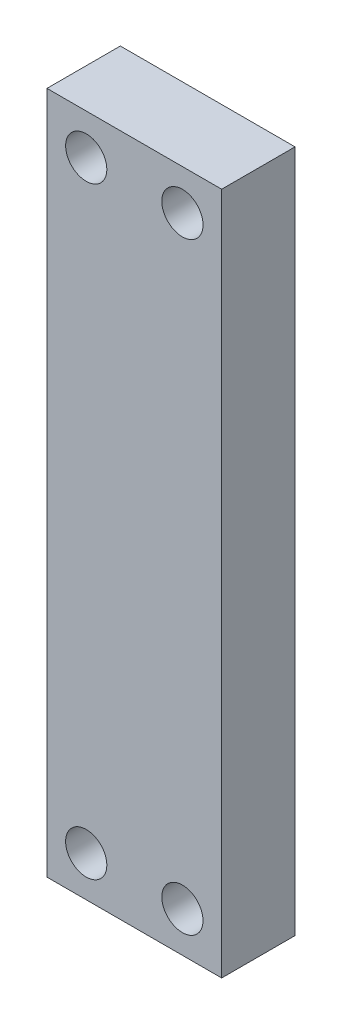
ISO-10303-21;
HEADER;
FILE_DESCRIPTION(('STEP AP214'),'2;1');
FILE_NAME('part.step','',(''),(''),'','','');
FILE_SCHEMA(('AUTOMOTIVE_DESIGN { 1 0 10303 214 1 1 1 1 }'));
ENDSEC;
DATA;
#1=APPLICATION_CONTEXT('core data for automotive mechanical design processes');
#2=APPLICATION_PROTOCOL_DEFINITION('international standard','automotive_design',2000,#1);
#3=PRODUCT_CONTEXT('',#1,'mechanical');
#4=PRODUCT('Part','Part','',(#3));
#5=PRODUCT_RELATED_PRODUCT_CATEGORY('part','',(#4));
#6=PRODUCT_DEFINITION_FORMATION('','',#4);
#7=PRODUCT_DEFINITION_CONTEXT('part definition',#1,'design');
#8=PRODUCT_DEFINITION('design','',#6,#7);
#9=PRODUCT_DEFINITION_SHAPE('','',#8);
#10=(LENGTH_UNIT() NAMED_UNIT(*) SI_UNIT(.MILLI.,.METRE.));
#11=(NAMED_UNIT(*) PLANE_ANGLE_UNIT() SI_UNIT($,.RADIAN.));
#12=(NAMED_UNIT(*) SI_UNIT($,.STERADIAN.) SOLID_ANGLE_UNIT());
#13=UNCERTAINTY_MEASURE_WITH_UNIT(LENGTH_MEASURE(1.E-05),#10,'distance_accuracy_value','');
#14=(GEOMETRIC_REPRESENTATION_CONTEXT(3) GLOBAL_UNCERTAINTY_ASSIGNED_CONTEXT((#13)) GLOBAL_UNIT_ASSIGNED_CONTEXT((#10,
#11,#12)) REPRESENTATION_CONTEXT('',''));
#15=CARTESIAN_POINT('',(0.,0.,0.));
#16=DIRECTION('',(0.,0.,1.));
#17=DIRECTION('',(1.,0.,0.));
#18=AXIS2_PLACEMENT_3D('',#15,#16,#17);
#19=CARTESIAN_POINT('',(9.525,37.2491,8.001));
#20=DIRECTION('',(-1.,0.,0.));
#21=DIRECTION('',(0.,-1.,0.));
#22=AXIS2_PLACEMENT_3D('',#19,#20,#21);
#23=PLANE('',#22);
#24=DIRECTION('',(0.,1.,0.));
#25=VECTOR('',#24,1.);
#26=CARTESIAN_POINT('',(9.525,37.2491,0.));
#27=LINE('',#26,#25);
#28=CARTESIAN_POINT('',(9.52500000000001,-37.2491,0.));
#29=VERTEX_POINT('',#28);
#30=CARTESIAN_POINT('',(9.525,37.2491,0.));
#31=VERTEX_POINT('',#30);
#32=EDGE_CURVE('E97',#29,#31,#27,.T.);
#33=ORIENTED_EDGE('',*,*,#32,.T.);
#34=DIRECTION('',(0.,0.,-1.));
#35=VECTOR('',#34,1.);
#36=CARTESIAN_POINT('',(9.525,37.2491,8.001));
#37=LINE('',#36,#35);
#38=CARTESIAN_POINT('',(9.525,37.2491,8.001));
#39=VERTEX_POINT('',#38);
#40=EDGE_CURVE('E11',#39,#31,#37,.T.);
#41=ORIENTED_EDGE('',*,*,#40,.F.);
#42=DIRECTION('',(0.,1.,0.));
#43=VECTOR('',#42,1.);
#44=CARTESIAN_POINT('',(9.525,37.2491,8.001));
#45=LINE('',#44,#43);
#46=CARTESIAN_POINT('',(9.52500000000001,-37.2491,8.001));
#47=VERTEX_POINT('',#46);
#48=EDGE_CURVE('E85',#47,#39,#45,.T.);
#49=ORIENTED_EDGE('',*,*,#48,.F.);
#50=DIRECTION('',(0.,0.,-1.));
#51=VECTOR('',#50,1.);
#52=CARTESIAN_POINT('',(9.52500000000001,-37.2491,8.001));
#53=LINE('',#52,#51);
#54=EDGE_CURVE('E93',#47,#29,#53,.T.);
#55=ORIENTED_EDGE('',*,*,#54,.T.);
#56=EDGE_LOOP('',(#33,#41,#49,#55));
#57=FACE_BOUND('',#56,.T.);
#58=ADVANCED_FACE('F34',(#57),#23,.F.);
#59=CARTESIAN_POINT('',(-9.525,37.2491,8.001));
#60=DIRECTION('',(0.,-1.,0.));
#61=DIRECTION('',(0.,0.,-1.));
#62=AXIS2_PLACEMENT_3D('',#59,#60,#61);
#63=PLANE('',#62);
#64=DIRECTION('',(-1.,0.,0.));
#65=VECTOR('',#64,1.);
#66=CARTESIAN_POINT('',(-9.525,37.2491,0.));
#67=LINE('',#66,#65);
#68=CARTESIAN_POINT('',(-9.525,37.2491,0.));
#69=VERTEX_POINT('',#68);
#70=EDGE_CURVE('E89',#31,#69,#67,.T.);
#71=ORIENTED_EDGE('',*,*,#70,.T.);
#72=DIRECTION('',(0.,0.,-1.));
#73=VECTOR('',#72,1.);
#74=CARTESIAN_POINT('',(-9.525,37.2491,8.001));
#75=LINE('',#74,#73);
#76=CARTESIAN_POINT('',(-9.525,37.2491,8.001));
#77=VERTEX_POINT('',#76);
#78=EDGE_CURVE('E42',#77,#69,#75,.T.);
#79=ORIENTED_EDGE('',*,*,#78,.F.);
#80=DIRECTION('',(-1.,0.,0.));
#81=VECTOR('',#80,1.);
#82=CARTESIAN_POINT('',(-9.525,37.2491,8.001));
#83=LINE('',#82,#81);
#84=EDGE_CURVE('E80',#39,#77,#83,.T.);
#85=ORIENTED_EDGE('',*,*,#84,.F.);
#86=ORIENTED_EDGE('',*,*,#40,.T.);
#87=EDGE_LOOP('',(#71,#79,#85,#86));
#88=FACE_BOUND('',#87,.T.);
#89=ADVANCED_FACE('F88',(#88),#63,.F.);
#90=CARTESIAN_POINT('',(-9.525,37.2491,8.001));
#91=DIRECTION('',(1.,0.,0.));
#92=DIRECTION('',(0.,1.,0.));
#93=AXIS2_PLACEMENT_3D('',#90,#91,#92);
#94=PLANE('',#93);
#95=DIRECTION('',(0.,-1.,0.));
#96=VECTOR('',#95,1.);
#97=CARTESIAN_POINT('',(-9.525,37.2491,0.));
#98=LINE('',#97,#96);
#99=CARTESIAN_POINT('',(-9.525,-37.2491,0.));
#100=VERTEX_POINT('',#99);
#101=EDGE_CURVE('E67',#69,#100,#98,.T.);
#102=ORIENTED_EDGE('',*,*,#101,.T.);
#103=DIRECTION('',(0.,0.,-1.));
#104=VECTOR('',#103,1.);
#105=CARTESIAN_POINT('',(-9.525,-37.2491,8.001));
#106=LINE('',#105,#104);
#107=CARTESIAN_POINT('',(-9.525,-37.2491,8.001));
#108=VERTEX_POINT('',#107);
#109=EDGE_CURVE('E90',#108,#100,#106,.T.);
#110=ORIENTED_EDGE('',*,*,#109,.F.);
#111=DIRECTION('',(0.,-1.,0.));
#112=VECTOR('',#111,1.);
#113=CARTESIAN_POINT('',(-9.525,37.2491,8.001));
#114=LINE('',#113,#112);
#115=EDGE_CURVE('E83',#77,#108,#114,.T.);
#116=ORIENTED_EDGE('',*,*,#115,.F.);
#117=ORIENTED_EDGE('',*,*,#78,.T.);
#118=EDGE_LOOP('',(#102,#110,#116,#117));
#119=FACE_BOUND('',#118,.T.);
#120=ADVANCED_FACE('F91',(#119),#94,.F.);
#121=CARTESIAN_POINT('',(-9.525,-37.2491,8.001));
#122=DIRECTION('',(0.,1.,0.));
#123=DIRECTION('',(0.,0.,1.));
#124=AXIS2_PLACEMENT_3D('',#121,#122,#123);
#125=PLANE('',#124);
#126=DIRECTION('',(1.,0.,0.));
#127=VECTOR('',#126,1.);
#128=CARTESIAN_POINT('',(-9.525,-37.2491,0.));
#129=LINE('',#128,#127);
#130=EDGE_CURVE('E73',#100,#29,#129,.T.);
#131=ORIENTED_EDGE('',*,*,#130,.T.);
#132=ORIENTED_EDGE('',*,*,#54,.F.);
#133=DIRECTION('',(1.,0.,0.));
#134=VECTOR('',#133,1.);
#135=CARTESIAN_POINT('',(-9.525,-37.2491,8.001));
#136=LINE('',#135,#134);
#137=EDGE_CURVE('E50',#108,#47,#136,.T.);
#138=ORIENTED_EDGE('',*,*,#137,.F.);
#139=ORIENTED_EDGE('',*,*,#109,.T.);
#140=EDGE_LOOP('',(#131,#132,#138,#139));
#141=FACE_BOUND('',#140,.T.);
#142=ADVANCED_FACE('F105',(#141),#125,.F.);
#143=CARTESIAN_POINT('',(0.,0.,8.001));
#144=DIRECTION('',(0.,0.,1.));
#145=DIRECTION('',(1.,0.,0.));
#146=AXIS2_PLACEMENT_3D('',#143,#144,#145);
#147=PLANE('',#146);
#148=CARTESIAN_POINT('',(-5.24510000000001,32.8549,8.001));
#149=DIRECTION('',(0.,0.,1.));
#150=DIRECTION('',(1.,0.,0.));
#151=AXIS2_PLACEMENT_3D('',#148,#149,#150);
#152=CIRCLE('',#151,2.2479);
#153=CARTESIAN_POINT('',(-2.99720000000001,32.8549,8.001));
#154=VERTEX_POINT('',#153);
#155=EDGE_CURVE('E131',#154,#154,#152,.T.);
#156=ORIENTED_EDGE('',*,*,#155,.F.);
#157=EDGE_LOOP('',(#156));
#158=FACE_BOUND('',#157,.T.);
#159=CARTESIAN_POINT('',(5.2451,-32.8549,8.001));
#160=DIRECTION('',(0.,0.,1.));
#161=DIRECTION('',(1.,0.,0.));
#162=AXIS2_PLACEMENT_3D('',#159,#160,#161);
#163=CIRCLE('',#162,2.2479);
#164=CARTESIAN_POINT('',(7.493,-32.8549,8.001));
#165=VERTEX_POINT('',#164);
#166=EDGE_CURVE('E125',#165,#165,#163,.T.);
#167=ORIENTED_EDGE('',*,*,#166,.F.);
#168=EDGE_LOOP('',(#167));
#169=FACE_BOUND('',#168,.T.);
#170=CARTESIAN_POINT('',(-5.2451,-32.8549,8.001));
#171=DIRECTION('',(0.,0.,1.));
#172=DIRECTION('',(1.,0.,0.));
#173=AXIS2_PLACEMENT_3D('',#170,#171,#172);
#174=CIRCLE('',#173,2.2479);
#175=CARTESIAN_POINT('',(-2.9972,-32.8549,8.001));
#176=VERTEX_POINT('',#175);
#177=EDGE_CURVE('E119',#176,#176,#174,.T.);
#178=ORIENTED_EDGE('',*,*,#177,.F.);
#179=EDGE_LOOP('',(#178));
#180=FACE_BOUND('',#179,.T.);
#181=CARTESIAN_POINT('',(5.24509999999999,32.8549,8.001));
#182=DIRECTION('',(0.,0.,1.));
#183=DIRECTION('',(1.,0.,0.));
#184=AXIS2_PLACEMENT_3D('',#181,#182,#183);
#185=CIRCLE('',#184,2.2479);
#186=CARTESIAN_POINT('',(7.49299999999999,32.8549,8.001));
#187=VERTEX_POINT('',#186);
#188=EDGE_CURVE('E113',#187,#187,#185,.T.);
#189=ORIENTED_EDGE('',*,*,#188,.F.);
#190=EDGE_LOOP('',(#189));
#191=FACE_BOUND('',#190,.T.);
#192=ORIENTED_EDGE('',*,*,#48,.T.);
#193=ORIENTED_EDGE('',*,*,#84,.T.);
#194=ORIENTED_EDGE('',*,*,#115,.T.);
#195=ORIENTED_EDGE('',*,*,#137,.T.);
#196=EDGE_LOOP('',(#192,#193,#194,#195));
#197=FACE_BOUND('',#196,.T.);
#198=ADVANCED_FACE('F81',(#158,#169,#180,#191,#197),#147,.T.);
#199=CARTESIAN_POINT('',(0.,0.,0.));
#200=DIRECTION('',(0.,0.,1.));
#201=DIRECTION('',(1.,0.,0.));
#202=AXIS2_PLACEMENT_3D('',#199,#200,#201);
#203=PLANE('',#202);
#204=CARTESIAN_POINT('',(-5.24510000000001,32.8549,0.));
#205=DIRECTION('',(0.,0.,1.));
#206=DIRECTION('',(1.,0.,0.));
#207=AXIS2_PLACEMENT_3D('',#204,#205,#206);
#208=CIRCLE('',#207,2.2479);
#209=CARTESIAN_POINT('',(-2.99720000000001,32.8549,0.));
#210=VERTEX_POINT('',#209);
#211=EDGE_CURVE('E128',#210,#210,#208,.T.);
#212=ORIENTED_EDGE('',*,*,#211,.T.);
#213=EDGE_LOOP('',(#212));
#214=FACE_BOUND('',#213,.T.);
#215=CARTESIAN_POINT('',(5.2451,-32.8549,0.));
#216=DIRECTION('',(0.,0.,1.));
#217=DIRECTION('',(1.,0.,0.));
#218=AXIS2_PLACEMENT_3D('',#215,#216,#217);
#219=CIRCLE('',#218,2.2479);
#220=CARTESIAN_POINT('',(7.493,-32.8549,0.));
#221=VERTEX_POINT('',#220);
#222=EDGE_CURVE('E122',#221,#221,#219,.T.);
#223=ORIENTED_EDGE('',*,*,#222,.T.);
#224=EDGE_LOOP('',(#223));
#225=FACE_BOUND('',#224,.T.);
#226=CARTESIAN_POINT('',(-5.2451,-32.8549,0.));
#227=DIRECTION('',(0.,0.,1.));
#228=DIRECTION('',(1.,0.,0.));
#229=AXIS2_PLACEMENT_3D('',#226,#227,#228);
#230=CIRCLE('',#229,2.2479);
#231=CARTESIAN_POINT('',(-2.9972,-32.8549,0.));
#232=VERTEX_POINT('',#231);
#233=EDGE_CURVE('E116',#232,#232,#230,.T.);
#234=ORIENTED_EDGE('',*,*,#233,.T.);
#235=EDGE_LOOP('',(#234));
#236=FACE_BOUND('',#235,.T.);
#237=CARTESIAN_POINT('',(5.24509999999999,32.8549,0.));
#238=DIRECTION('',(0.,0.,1.));
#239=DIRECTION('',(1.,0.,0.));
#240=AXIS2_PLACEMENT_3D('',#237,#238,#239);
#241=CIRCLE('',#240,2.2479);
#242=CARTESIAN_POINT('',(7.49299999999999,32.8549,0.));
#243=VERTEX_POINT('',#242);
#244=EDGE_CURVE('E100',#243,#243,#241,.T.);
#245=ORIENTED_EDGE('',*,*,#244,.T.);
#246=EDGE_LOOP('',(#245));
#247=FACE_BOUND('',#246,.T.);
#248=ORIENTED_EDGE('',*,*,#32,.F.);
#249=ORIENTED_EDGE('',*,*,#130,.F.);
#250=ORIENTED_EDGE('',*,*,#101,.F.);
#251=ORIENTED_EDGE('',*,*,#70,.F.);
#252=EDGE_LOOP('',(#248,#249,#250,#251));
#253=FACE_BOUND('',#252,.T.);
#254=ADVANCED_FACE('F108',(#214,#225,#236,#247,#253),#203,.F.);
#255=CARTESIAN_POINT('',(5.24509999999999,32.8549,8.001));
#256=DIRECTION('',(0.,0.,1.));
#257=DIRECTION('',(1.,0.,0.));
#258=AXIS2_PLACEMENT_3D('',#255,#256,#257);
#259=CYLINDRICAL_SURFACE('',#258,2.2479);
#260=ORIENTED_EDGE('',*,*,#244,.F.);
#261=EDGE_LOOP('',(#260));
#262=FACE_BOUND('',#261,.T.);
#263=ORIENTED_EDGE('',*,*,#188,.T.);
#264=EDGE_LOOP('',(#263));
#265=FACE_BOUND('',#264,.T.);
#266=ADVANCED_FACE('F146',(#262,#265),#259,.F.);
#267=CARTESIAN_POINT('',(-5.2451,-32.8549,8.001));
#268=DIRECTION('',(0.,0.,1.));
#269=DIRECTION('',(1.,0.,0.));
#270=AXIS2_PLACEMENT_3D('',#267,#268,#269);
#271=CYLINDRICAL_SURFACE('',#270,2.2479);
#272=ORIENTED_EDGE('',*,*,#233,.F.);
#273=EDGE_LOOP('',(#272));
#274=FACE_BOUND('',#273,.T.);
#275=ORIENTED_EDGE('',*,*,#177,.T.);
#276=EDGE_LOOP('',(#275));
#277=FACE_BOUND('',#276,.T.);
#278=ADVANCED_FACE('F148',(#274,#277),#271,.F.);
#279=CARTESIAN_POINT('',(5.2451,-32.8549,8.001));
#280=DIRECTION('',(0.,0.,1.));
#281=DIRECTION('',(1.,0.,0.));
#282=AXIS2_PLACEMENT_3D('',#279,#280,#281);
#283=CYLINDRICAL_SURFACE('',#282,2.2479);
#284=ORIENTED_EDGE('',*,*,#222,.F.);
#285=EDGE_LOOP('',(#284));
#286=FACE_BOUND('',#285,.T.);
#287=ORIENTED_EDGE('',*,*,#166,.T.);
#288=EDGE_LOOP('',(#287));
#289=FACE_BOUND('',#288,.T.);
#290=ADVANCED_FACE('F155',(#286,#289),#283,.F.);
#291=CARTESIAN_POINT('',(-5.24510000000001,32.8549,8.001));
#292=DIRECTION('',(0.,0.,1.));
#293=DIRECTION('',(1.,0.,0.));
#294=AXIS2_PLACEMENT_3D('',#291,#292,#293);
#295=CYLINDRICAL_SURFACE('',#294,2.2479);
#296=ORIENTED_EDGE('',*,*,#211,.F.);
#297=EDGE_LOOP('',(#296));
#298=FACE_BOUND('',#297,.T.);
#299=ORIENTED_EDGE('',*,*,#155,.T.);
#300=EDGE_LOOP('',(#299));
#301=FACE_BOUND('',#300,.T.);
#302=ADVANCED_FACE('F135',(#298,#301),#295,.F.);
#303=CLOSED_SHELL('',(#58,#89,#120,#142,#198,#254,#266,#278,#290,#302));
#304=MANIFOLD_SOLID_BREP('B2',#303);
#305=ADVANCED_BREP_SHAPE_REPRESENTATION('',(#18,#304),#14);
#306=SHAPE_DEFINITION_REPRESENTATION(#9,#305);
ENDSEC;
END-ISO-10303-21;
